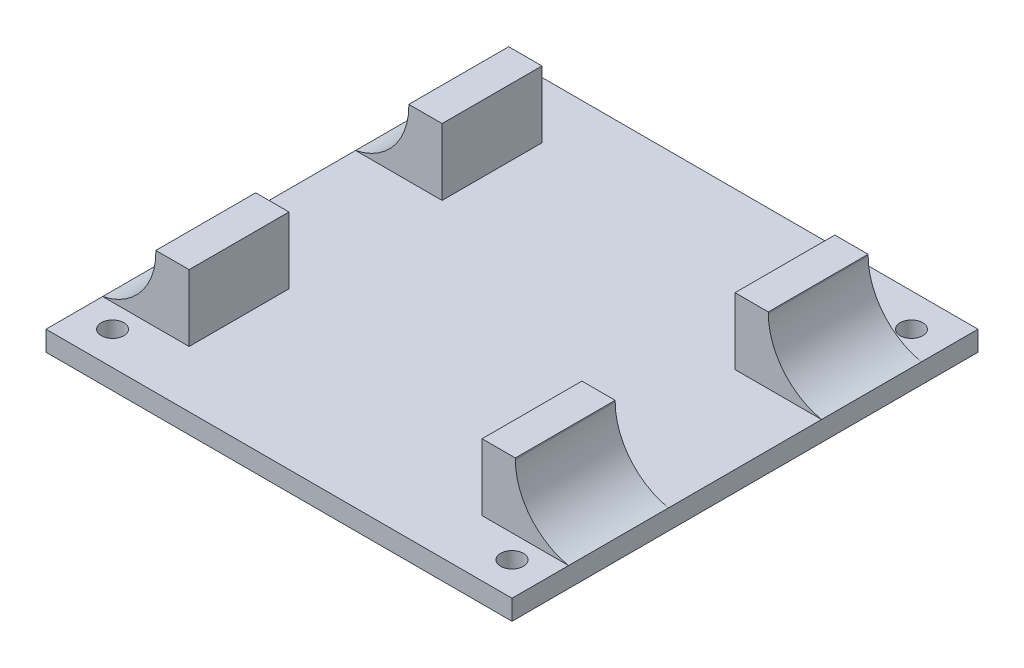
ISO-10303-21;
HEADER;
FILE_DESCRIPTION(('STEP AP214'),'2;1');
FILE_NAME('part.step','',(''),(''),'','','');
FILE_SCHEMA(('AUTOMOTIVE_DESIGN { 1 0 10303 214 1 1 1 1 }'));
ENDSEC;
DATA;
#1=APPLICATION_CONTEXT('core data for automotive mechanical design processes');
#2=APPLICATION_PROTOCOL_DEFINITION('international standard','automotive_design',2000,#1);
#3=PRODUCT_CONTEXT('',#1,'mechanical');
#4=PRODUCT('Part','Part','',(#3));
#5=PRODUCT_RELATED_PRODUCT_CATEGORY('part','',(#4));
#6=PRODUCT_DEFINITION_FORMATION('','',#4);
#7=PRODUCT_DEFINITION_CONTEXT('part definition',#1,'design');
#8=PRODUCT_DEFINITION('design','',#6,#7);
#9=PRODUCT_DEFINITION_SHAPE('','',#8);
#10=(LENGTH_UNIT() NAMED_UNIT(*) SI_UNIT(.MILLI.,.METRE.));
#11=(NAMED_UNIT(*) PLANE_ANGLE_UNIT() SI_UNIT($,.RADIAN.));
#12=(NAMED_UNIT(*) SI_UNIT($,.STERADIAN.) SOLID_ANGLE_UNIT());
#13=UNCERTAINTY_MEASURE_WITH_UNIT(LENGTH_MEASURE(1.E-05),#10,'distance_accuracy_value','');
#14=(GEOMETRIC_REPRESENTATION_CONTEXT(3) GLOBAL_UNCERTAINTY_ASSIGNED_CONTEXT((#13)) GLOBAL_UNIT_ASSIGNED_CONTEXT((#10,
#11,#12)) REPRESENTATION_CONTEXT('',''));
#15=CARTESIAN_POINT('',(0.,0.,0.));
#16=DIRECTION('',(0.,0.,1.));
#17=DIRECTION('',(1.,0.,0.));
#18=AXIS2_PLACEMENT_3D('',#15,#16,#17);
#19=CARTESIAN_POINT('',(0.,3.,0.));
#20=DIRECTION('',(0.,-1.,0.));
#21=DIRECTION('',(0.,0.,-1.));
#22=AXIS2_PLACEMENT_3D('',#19,#20,#21);
#23=PLANE('',#22);
#24=DIRECTION('',(-1.,0.,0.));
#25=VECTOR('',#24,1.);
#26=CARTESIAN_POINT('',(57.,3.,-23.5));
#27=LINE('',#26,#25);
#28=CARTESIAN_POINT('',(70.,3.,-23.5));
#29=VERTEX_POINT('',#28);
#30=CARTESIAN_POINT('',(57.,3.,-23.5));
#31=VERTEX_POINT('',#30);
#32=EDGE_CURVE('E250',#29,#31,#27,.T.);
#33=ORIENTED_EDGE('',*,*,#32,.F.);
#34=DIRECTION('',(0.,0.,-1.));
#35=VECTOR('',#34,1.);
#36=CARTESIAN_POINT('',(70.,3.,0.));
#37=LINE('',#36,#35);
#38=CARTESIAN_POINT('',(70.,3.,-46.5));
#39=VERTEX_POINT('',#38);
#40=EDGE_CURVE('E528',#29,#39,#37,.T.);
#41=ORIENTED_EDGE('',*,*,#40,.T.);
#42=DIRECTION('',(1.,0.,0.));
#43=VECTOR('',#42,1.);
#44=CARTESIAN_POINT('',(57.,3.,-46.5));
#45=LINE('',#44,#43);
#46=CARTESIAN_POINT('',(57.,3.,-46.5));
#47=VERTEX_POINT('',#46);
#48=EDGE_CURVE('E303',#47,#39,#45,.T.);
#49=ORIENTED_EDGE('',*,*,#48,.F.);
#50=DIRECTION('',(0.,0.,1.));
#51=VECTOR('',#50,1.);
#52=CARTESIAN_POINT('',(57.,3.,-61.5));
#53=LINE('',#52,#51);
#54=CARTESIAN_POINT('',(57.,3.,-61.5));
#55=VERTEX_POINT('',#54);
#56=EDGE_CURVE('E306',#55,#47,#53,.T.);
#57=ORIENTED_EDGE('',*,*,#56,.F.);
#58=DIRECTION('',(-1.,0.,0.));
#59=VECTOR('',#58,1.);
#60=CARTESIAN_POINT('',(57.,3.,-61.5));
#61=LINE('',#60,#59);
#62=CARTESIAN_POINT('',(70.,3.,-61.5));
#63=VERTEX_POINT('',#62);
#64=EDGE_CURVE('E311',#63,#55,#61,.T.);
#65=ORIENTED_EDGE('',*,*,#64,.F.);
#66=CARTESIAN_POINT('',(70.,3.,-70.));
#67=VERTEX_POINT('',#66);
#68=EDGE_CURVE('E407',#63,#67,#37,.T.);
#69=ORIENTED_EDGE('',*,*,#68,.T.);
#70=DIRECTION('',(-1.,0.,0.));
#71=VECTOR('',#70,1.);
#72=CARTESIAN_POINT('',(0.,3.,-70.));
#73=LINE('',#72,#71);
#74=CARTESIAN_POINT('',(0.,3.,-70.));
#75=VERTEX_POINT('',#74);
#76=EDGE_CURVE('E412',#67,#75,#73,.T.);
#77=ORIENTED_EDGE('',*,*,#76,.T.);
#78=DIRECTION('',(0.,0.,1.));
#79=VECTOR('',#78,1.);
#80=CARTESIAN_POINT('',(0.,3.,0.));
#81=LINE('',#80,#79);
#82=CARTESIAN_POINT('',(0.,3.,-61.5));
#83=VERTEX_POINT('',#82);
#84=EDGE_CURVE('E398',#75,#83,#81,.T.);
#85=ORIENTED_EDGE('',*,*,#84,.T.);
#86=DIRECTION('',(-1.,0.,0.));
#87=VECTOR('',#86,1.);
#88=CARTESIAN_POINT('',(8.00000000000001,3.,-61.5));
#89=LINE('',#88,#87);
#90=CARTESIAN_POINT('',(13.,3.,-61.5));
#91=VERTEX_POINT('',#90);
#92=EDGE_CURVE('E345',#91,#83,#89,.T.);
#93=ORIENTED_EDGE('',*,*,#92,.F.);
#94=DIRECTION('',(0.,0.,-1.));
#95=VECTOR('',#94,1.);
#96=CARTESIAN_POINT('',(13.,3.,-61.5));
#97=LINE('',#96,#95);
#98=CARTESIAN_POINT('',(13.,3.,-46.5));
#99=VERTEX_POINT('',#98);
#100=EDGE_CURVE('E315',#99,#91,#97,.T.);
#101=ORIENTED_EDGE('',*,*,#100,.F.);
#102=DIRECTION('',(1.,0.,0.));
#103=VECTOR('',#102,1.);
#104=CARTESIAN_POINT('',(8.00000000000001,3.,-46.5));
#105=LINE('',#104,#103);
#106=CARTESIAN_POINT('',(0.,3.,-46.5));
#107=VERTEX_POINT('',#106);
#108=EDGE_CURVE('E332',#107,#99,#105,.T.);
#109=ORIENTED_EDGE('',*,*,#108,.F.);
#110=CARTESIAN_POINT('',(0.,3.,-23.5));
#111=VERTEX_POINT('',#110);
#112=EDGE_CURVE('E488',#107,#111,#81,.T.);
#113=ORIENTED_EDGE('',*,*,#112,.T.);
#114=DIRECTION('',(-1.,0.,0.));
#115=VECTOR('',#114,1.);
#116=CARTESIAN_POINT('',(8.00000000000001,3.,-23.5));
#117=LINE('',#116,#115);
#118=CARTESIAN_POINT('',(13.,3.,-23.5));
#119=VERTEX_POINT('',#118);
#120=EDGE_CURVE('E267',#119,#111,#117,.T.);
#121=ORIENTED_EDGE('',*,*,#120,.F.);
#122=DIRECTION('',(0.,0.,-1.));
#123=VECTOR('',#122,1.);
#124=CARTESIAN_POINT('',(13.,3.,-23.5));
#125=LINE('',#124,#123);
#126=CARTESIAN_POINT('',(13.,3.,-8.5));
#127=VERTEX_POINT('',#126);
#128=EDGE_CURVE('E271',#127,#119,#125,.T.);
#129=ORIENTED_EDGE('',*,*,#128,.F.);
#130=DIRECTION('',(1.,0.,0.));
#131=VECTOR('',#130,1.);
#132=CARTESIAN_POINT('',(8.00000000000001,3.,-8.5));
#133=LINE('',#132,#131);
#134=CARTESIAN_POINT('',(0.,3.,-8.5));
#135=VERTEX_POINT('',#134);
#136=EDGE_CURVE('E263',#135,#127,#133,.T.);
#137=ORIENTED_EDGE('',*,*,#136,.F.);
#138=CARTESIAN_POINT('',(0.,3.,0.));
#139=VERTEX_POINT('',#138);
#140=EDGE_CURVE('E404',#135,#139,#81,.T.);
#141=ORIENTED_EDGE('',*,*,#140,.T.);
#142=DIRECTION('',(1.,0.,0.));
#143=VECTOR('',#142,1.);
#144=CARTESIAN_POINT('',(0.,3.,0.));
#145=LINE('',#144,#143);
#146=CARTESIAN_POINT('',(70.,3.,0.));
#147=VERTEX_POINT('',#146);
#148=EDGE_CURVE('E402',#139,#147,#145,.T.);
#149=ORIENTED_EDGE('',*,*,#148,.T.);
#150=CARTESIAN_POINT('',(70.,3.,-8.5));
#151=VERTEX_POINT('',#150);
#152=EDGE_CURVE('E408',#147,#151,#37,.T.);
#153=ORIENTED_EDGE('',*,*,#152,.T.);
#154=DIRECTION('',(1.,0.,0.));
#155=VECTOR('',#154,1.);
#156=CARTESIAN_POINT('',(57.,3.,-8.5));
#157=LINE('',#156,#155);
#158=CARTESIAN_POINT('',(57.,3.,-8.5));
#159=VERTEX_POINT('',#158);
#160=EDGE_CURVE('E235',#159,#151,#157,.T.);
#161=ORIENTED_EDGE('',*,*,#160,.F.);
#162=DIRECTION('',(0.,0.,1.));
#163=VECTOR('',#162,1.);
#164=CARTESIAN_POINT('',(57.,3.,-23.5));
#165=LINE('',#164,#163);
#166=EDGE_CURVE('E240',#31,#159,#165,.T.);
#167=ORIENTED_EDGE('',*,*,#166,.F.);
#168=EDGE_LOOP('',(#33,#41,#49,#57,#65,#69,#77,#85,#93,#101,#109,#113,#121,#129,#137,#141,#149,
#153,#161,#167));
#169=FACE_BOUND('',#168,.T.);
#170=CARTESIAN_POINT('',(65.,3.,-65.));
#171=DIRECTION('',(0.,1.,0.));
#172=DIRECTION('',(0.,0.,1.));
#173=AXIS2_PLACEMENT_3D('',#170,#171,#172);
#174=CIRCLE('',#173,1.7);
#175=CARTESIAN_POINT('',(65.,3.,-63.3));
#176=VERTEX_POINT('',#175);
#177=EDGE_CURVE('E390',#176,#176,#174,.T.);
#178=ORIENTED_EDGE('',*,*,#177,.F.);
#179=EDGE_LOOP('',(#178));
#180=FACE_BOUND('',#179,.T.);
#181=CARTESIAN_POINT('',(5.,3.,-65.));
#182=DIRECTION('',(0.,1.,0.));
#183=DIRECTION('',(0.,0.,-1.));
#184=AXIS2_PLACEMENT_3D('',#181,#182,#183);
#185=CIRCLE('',#184,1.69999999999999);
#186=CARTESIAN_POINT('',(5.,3.,-66.7));
#187=VERTEX_POINT('',#186);
#188=EDGE_CURVE('E382',#187,#187,#185,.T.);
#189=ORIENTED_EDGE('',*,*,#188,.F.);
#190=EDGE_LOOP('',(#189));
#191=FACE_BOUND('',#190,.T.);
#192=CARTESIAN_POINT('',(65.,3.,-5.));
#193=DIRECTION('',(0.,1.,0.));
#194=DIRECTION('',(0.,0.,-1.));
#195=AXIS2_PLACEMENT_3D('',#192,#193,#194);
#196=CIRCLE('',#195,1.7);
#197=CARTESIAN_POINT('',(65.,3.,-6.7));
#198=VERTEX_POINT('',#197);
#199=EDGE_CURVE('E374',#198,#198,#196,.T.);
#200=ORIENTED_EDGE('',*,*,#199,.F.);
#201=EDGE_LOOP('',(#200));
#202=FACE_BOUND('',#201,.T.);
#203=CARTESIAN_POINT('',(5.,3.,-5.));
#204=DIRECTION('',(0.,1.,0.));
#205=DIRECTION('',(0.,0.,1.));
#206=AXIS2_PLACEMENT_3D('',#203,#204,#205);
#207=CIRCLE('',#206,1.69999999999999);
#208=CARTESIAN_POINT('',(5.,3.,-3.30000000000001));
#209=VERTEX_POINT('',#208);
#210=EDGE_CURVE('E366',#209,#209,#207,.T.);
#211=ORIENTED_EDGE('',*,*,#210,.F.);
#212=EDGE_LOOP('',(#211));
#213=FACE_BOUND('',#212,.T.);
#214=ADVANCED_FACE('F45',(#169,#180,#191,#202,#213),#23,.F.);
#215=CARTESIAN_POINT('',(0.,0.,0.));
#216=DIRECTION('',(0.,-1.,0.));
#217=DIRECTION('',(0.,0.,-1.));
#218=AXIS2_PLACEMENT_3D('',#215,#216,#217);
#219=PLANE('',#218);
#220=CARTESIAN_POINT('',(65.,0.,-5.));
#221=DIRECTION('',(0.,1.,0.));
#222=DIRECTION('',(0.,0.,-1.));
#223=AXIS2_PLACEMENT_3D('',#220,#221,#222);
#224=CIRCLE('',#223,1.7);
#225=CARTESIAN_POINT('',(65.,0.,-6.7));
#226=VERTEX_POINT('',#225);
#227=EDGE_CURVE('E370',#226,#226,#224,.T.);
#228=ORIENTED_EDGE('',*,*,#227,.T.);
#229=EDGE_LOOP('',(#228));
#230=FACE_BOUND('',#229,.T.);
#231=CARTESIAN_POINT('',(65.,0.,-65.));
#232=DIRECTION('',(0.,1.,0.));
#233=DIRECTION('',(0.,0.,1.));
#234=AXIS2_PLACEMENT_3D('',#231,#232,#233);
#235=CIRCLE('',#234,1.7);
#236=CARTESIAN_POINT('',(65.,0.,-63.3));
#237=VERTEX_POINT('',#236);
#238=EDGE_CURVE('E386',#237,#237,#235,.T.);
#239=ORIENTED_EDGE('',*,*,#238,.T.);
#240=EDGE_LOOP('',(#239));
#241=FACE_BOUND('',#240,.T.);
#242=DIRECTION('',(0.,0.,1.));
#243=VECTOR('',#242,1.);
#244=CARTESIAN_POINT('',(0.,0.,0.));
#245=LINE('',#244,#243);
#246=CARTESIAN_POINT('',(0.,0.,-70.));
#247=VERTEX_POINT('',#246);
#248=CARTESIAN_POINT('',(0.,0.,0.));
#249=VERTEX_POINT('',#248);
#250=EDGE_CURVE('E394',#247,#249,#245,.T.);
#251=ORIENTED_EDGE('',*,*,#250,.F.);
#252=DIRECTION('',(-1.,0.,0.));
#253=VECTOR('',#252,1.);
#254=CARTESIAN_POINT('',(0.,0.,-70.));
#255=LINE('',#254,#253);
#256=CARTESIAN_POINT('',(70.,0.,-70.));
#257=VERTEX_POINT('',#256);
#258=EDGE_CURVE('E426',#257,#247,#255,.T.);
#259=ORIENTED_EDGE('',*,*,#258,.F.);
#260=DIRECTION('',(0.,0.,-1.));
#261=VECTOR('',#260,1.);
#262=CARTESIAN_POINT('',(70.,0.,0.));
#263=LINE('',#262,#261);
#264=CARTESIAN_POINT('',(70.,0.,0.));
#265=VERTEX_POINT('',#264);
#266=EDGE_CURVE('E423',#265,#257,#263,.T.);
#267=ORIENTED_EDGE('',*,*,#266,.F.);
#268=DIRECTION('',(1.,0.,0.));
#269=VECTOR('',#268,1.);
#270=CARTESIAN_POINT('',(0.,0.,0.));
#271=LINE('',#270,#269);
#272=EDGE_CURVE('E420',#249,#265,#271,.T.);
#273=ORIENTED_EDGE('',*,*,#272,.F.);
#274=EDGE_LOOP('',(#251,#259,#267,#273));
#275=FACE_BOUND('',#274,.T.);
#276=CARTESIAN_POINT('',(5.,0.,-65.));
#277=DIRECTION('',(0.,1.,0.));
#278=DIRECTION('',(0.,0.,-1.));
#279=AXIS2_PLACEMENT_3D('',#276,#277,#278);
#280=CIRCLE('',#279,1.69999999999999);
#281=CARTESIAN_POINT('',(5.,0.,-66.7));
#282=VERTEX_POINT('',#281);
#283=EDGE_CURVE('E378',#282,#282,#280,.T.);
#284=ORIENTED_EDGE('',*,*,#283,.T.);
#285=EDGE_LOOP('',(#284));
#286=FACE_BOUND('',#285,.T.);
#287=CARTESIAN_POINT('',(5.,0.,-5.));
#288=DIRECTION('',(0.,1.,0.));
#289=DIRECTION('',(0.,0.,1.));
#290=AXIS2_PLACEMENT_3D('',#287,#288,#289);
#291=CIRCLE('',#290,1.69999999999999);
#292=CARTESIAN_POINT('',(5.,0.,-3.30000000000001));
#293=VERTEX_POINT('',#292);
#294=EDGE_CURVE('E365',#293,#293,#291,.T.);
#295=ORIENTED_EDGE('',*,*,#294,.T.);
#296=EDGE_LOOP('',(#295));
#297=FACE_BOUND('',#296,.T.);
#298=ADVANCED_FACE('F549',(#230,#241,#275,#286,#297),#219,.T.);
#299=CARTESIAN_POINT('',(0.,3.,0.));
#300=DIRECTION('',(1.,0.,0.));
#301=DIRECTION('',(0.,0.,-1.));
#302=AXIS2_PLACEMENT_3D('',#299,#300,#301);
#303=PLANE('',#302);
#304=ORIENTED_EDGE('',*,*,#250,.T.);
#305=DIRECTION('',(0.,-1.,0.));
#306=VECTOR('',#305,1.);
#307=CARTESIAN_POINT('',(0.,3.,0.));
#308=LINE('',#307,#306);
#309=EDGE_CURVE('E440',#139,#249,#308,.T.);
#310=ORIENTED_EDGE('',*,*,#309,.F.);
#311=ORIENTED_EDGE('',*,*,#140,.F.);
#312=EDGE_CURVE('E493',#111,#135,#81,.T.);
#313=ORIENTED_EDGE('',*,*,#312,.F.);
#314=ORIENTED_EDGE('',*,*,#112,.F.);
#315=EDGE_CURVE('E403',#83,#107,#81,.T.);
#316=ORIENTED_EDGE('',*,*,#315,.F.);
#317=ORIENTED_EDGE('',*,*,#84,.F.);
#318=DIRECTION('',(0.,-1.,0.));
#319=VECTOR('',#318,1.);
#320=CARTESIAN_POINT('',(0.,3.,-70.));
#321=LINE('',#320,#319);
#322=EDGE_CURVE('E416',#75,#247,#321,.T.);
#323=ORIENTED_EDGE('',*,*,#322,.T.);
#324=EDGE_LOOP('',(#304,#310,#311,#313,#314,#316,#317,#323));
#325=FACE_BOUND('',#324,.T.);
#326=ADVANCED_FACE('F489',(#325),#303,.F.);
#327=CARTESIAN_POINT('',(0.,3.,0.));
#328=DIRECTION('',(0.,0.,-1.));
#329=DIRECTION('',(-1.,0.,0.));
#330=AXIS2_PLACEMENT_3D('',#327,#328,#329);
#331=PLANE('',#330);
#332=ORIENTED_EDGE('',*,*,#272,.T.);
#333=DIRECTION('',(0.,-1.,0.));
#334=VECTOR('',#333,1.);
#335=CARTESIAN_POINT('',(70.,3.,0.));
#336=LINE('',#335,#334);
#337=EDGE_CURVE('E436',#147,#265,#336,.T.);
#338=ORIENTED_EDGE('',*,*,#337,.F.);
#339=ORIENTED_EDGE('',*,*,#148,.F.);
#340=ORIENTED_EDGE('',*,*,#309,.T.);
#341=EDGE_LOOP('',(#332,#338,#339,#340));
#342=FACE_BOUND('',#341,.T.);
#343=ADVANCED_FACE('F567',(#342),#331,.F.);
#344=CARTESIAN_POINT('',(70.,3.,0.));
#345=DIRECTION('',(-1.,0.,0.));
#346=DIRECTION('',(0.,0.,1.));
#347=AXIS2_PLACEMENT_3D('',#344,#345,#346);
#348=PLANE('',#347);
#349=ORIENTED_EDGE('',*,*,#266,.T.);
#350=DIRECTION('',(0.,-1.,0.));
#351=VECTOR('',#350,1.);
#352=CARTESIAN_POINT('',(70.,3.,-70.));
#353=LINE('',#352,#351);
#354=EDGE_CURVE('E432',#67,#257,#353,.T.);
#355=ORIENTED_EDGE('',*,*,#354,.F.);
#356=ORIENTED_EDGE('',*,*,#68,.F.);
#357=EDGE_CURVE('E752',#39,#63,#37,.T.);
#358=ORIENTED_EDGE('',*,*,#357,.F.);
#359=ORIENTED_EDGE('',*,*,#40,.F.);
#360=EDGE_CURVE('E413',#151,#29,#37,.T.);
#361=ORIENTED_EDGE('',*,*,#360,.F.);
#362=ORIENTED_EDGE('',*,*,#152,.F.);
#363=ORIENTED_EDGE('',*,*,#337,.T.);
#364=EDGE_LOOP('',(#349,#355,#356,#358,#359,#361,#362,#363));
#365=FACE_BOUND('',#364,.T.);
#366=ADVANCED_FACE('F525',(#365),#348,.F.);
#367=CARTESIAN_POINT('',(0.,3.,-70.));
#368=DIRECTION('',(0.,0.,1.));
#369=DIRECTION('',(1.,0.,0.));
#370=AXIS2_PLACEMENT_3D('',#367,#368,#369);
#371=PLANE('',#370);
#372=ORIENTED_EDGE('',*,*,#258,.T.);
#373=ORIENTED_EDGE('',*,*,#322,.F.);
#374=ORIENTED_EDGE('',*,*,#76,.F.);
#375=ORIENTED_EDGE('',*,*,#354,.T.);
#376=EDGE_LOOP('',(#372,#373,#374,#375));
#377=FACE_BOUND('',#376,.T.);
#378=ADVANCED_FACE('F561',(#377),#371,.F.);
#379=CARTESIAN_POINT('',(65.,3.,-65.));
#380=DIRECTION('',(0.,-1.,0.));
#381=DIRECTION('',(0.,0.,-1.));
#382=AXIS2_PLACEMENT_3D('',#379,#380,#381);
#383=CYLINDRICAL_SURFACE('',#382,1.7);
#384=ORIENTED_EDGE('',*,*,#177,.T.);
#385=EDGE_LOOP('',(#384));
#386=FACE_BOUND('',#385,.T.);
#387=ORIENTED_EDGE('',*,*,#238,.F.);
#388=EDGE_LOOP('',(#387));
#389=FACE_BOUND('',#388,.T.);
#390=ADVANCED_FACE('F558',(#386,#389),#383,.F.);
#391=CARTESIAN_POINT('',(5.,3.,-65.));
#392=DIRECTION('',(0.,-1.,0.));
#393=DIRECTION('',(0.,0.,-1.));
#394=AXIS2_PLACEMENT_3D('',#391,#392,#393);
#395=CYLINDRICAL_SURFACE('',#394,1.69999999999999);
#396=ORIENTED_EDGE('',*,*,#188,.T.);
#397=EDGE_LOOP('',(#396));
#398=FACE_BOUND('',#397,.T.);
#399=ORIENTED_EDGE('',*,*,#283,.F.);
#400=EDGE_LOOP('',(#399));
#401=FACE_BOUND('',#400,.T.);
#402=ADVANCED_FACE('F784',(#398,#401),#395,.F.);
#403=CARTESIAN_POINT('',(65.,3.,-5.));
#404=DIRECTION('',(0.,-1.,0.));
#405=DIRECTION('',(0.,0.,-1.));
#406=AXIS2_PLACEMENT_3D('',#403,#404,#405);
#407=CYLINDRICAL_SURFACE('',#406,1.7);
#408=ORIENTED_EDGE('',*,*,#199,.T.);
#409=EDGE_LOOP('',(#408));
#410=FACE_BOUND('',#409,.T.);
#411=ORIENTED_EDGE('',*,*,#227,.F.);
#412=EDGE_LOOP('',(#411));
#413=FACE_BOUND('',#412,.T.);
#414=ADVANCED_FACE('F781',(#410,#413),#407,.F.);
#415=CARTESIAN_POINT('',(5.,3.,-5.));
#416=DIRECTION('',(0.,-1.,0.));
#417=DIRECTION('',(0.,0.,-1.));
#418=AXIS2_PLACEMENT_3D('',#415,#416,#417);
#419=CYLINDRICAL_SURFACE('',#418,1.69999999999999);
#420=ORIENTED_EDGE('',*,*,#210,.T.);
#421=EDGE_LOOP('',(#420));
#422=FACE_BOUND('',#421,.T.);
#423=ORIENTED_EDGE('',*,*,#294,.F.);
#424=EDGE_LOOP('',(#423));
#425=FACE_BOUND('',#424,.T.);
#426=ADVANCED_FACE('F777',(#422,#425),#419,.F.);
#427=CARTESIAN_POINT('',(13.,13.,-61.5));
#428=DIRECTION('',(-1.,0.,0.));
#429=DIRECTION('',(0.,0.,1.));
#430=AXIS2_PLACEMENT_3D('',#427,#428,#429);
#431=PLANE('',#430);
#432=ORIENTED_EDGE('',*,*,#100,.T.);
#433=DIRECTION('',(0.,-1.,0.));
#434=VECTOR('',#433,1.);
#435=CARTESIAN_POINT('',(13.,13.,-61.5));
#436=LINE('',#435,#434);
#437=CARTESIAN_POINT('',(13.,13.,-61.5));
#438=VERTEX_POINT('',#437);
#439=EDGE_CURVE('E361',#438,#91,#436,.T.);
#440=ORIENTED_EDGE('',*,*,#439,.F.);
#441=DIRECTION('',(0.,0.,-1.));
#442=VECTOR('',#441,1.);
#443=CARTESIAN_POINT('',(13.,13.,-61.5));
#444=LINE('',#443,#442);
#445=CARTESIAN_POINT('',(13.,13.,-46.5));
#446=VERTEX_POINT('',#445);
#447=EDGE_CURVE('E327',#446,#438,#444,.T.);
#448=ORIENTED_EDGE('',*,*,#447,.F.);
#449=DIRECTION('',(0.,-1.,0.));
#450=VECTOR('',#449,1.);
#451=CARTESIAN_POINT('',(13.,13.,-46.5));
#452=LINE('',#451,#450);
#453=EDGE_CURVE('E341',#446,#99,#452,.T.);
#454=ORIENTED_EDGE('',*,*,#453,.T.);
#455=EDGE_LOOP('',(#432,#440,#448,#454));
#456=FACE_BOUND('',#455,.T.);
#457=ADVANCED_FACE('F589',(#456),#431,.F.);
#458=CARTESIAN_POINT('',(8.00000000000001,13.,-61.5));
#459=DIRECTION('',(0.,0.,1.));
#460=DIRECTION('',(1.,0.,0.));
#461=AXIS2_PLACEMENT_3D('',#458,#459,#460);
#462=PLANE('',#461);
#463=ORIENTED_EDGE('',*,*,#92,.T.);
#464=CARTESIAN_POINT('',(-1.99999999999999,12.7979589711327,-61.5));
#465=DIRECTION('',(0.,0.,1.));
#466=DIRECTION('',(1.,0.,0.));
#467=AXIS2_PLACEMENT_3D('',#464,#465,#466);
#468=CIRCLE('',#467,10.);
#469=CARTESIAN_POINT('',(8.00000000000001,12.7979589711327,-61.5));
#470=VERTEX_POINT('',#469);
#471=EDGE_CURVE('E11',#83,#470,#468,.T.);
#472=ORIENTED_EDGE('',*,*,#471,.T.);
#473=DIRECTION('',(0.,-1.,0.));
#474=VECTOR('',#473,1.);
#475=CARTESIAN_POINT('',(8.00000000000001,13.,-61.5));
#476=LINE('',#475,#474);
#477=CARTESIAN_POINT('',(8.00000000000001,13.,-61.5));
#478=VERTEX_POINT('',#477);
#479=EDGE_CURVE('E358',#478,#470,#476,.T.);
#480=ORIENTED_EDGE('',*,*,#479,.F.);
#481=DIRECTION('',(-1.,0.,0.));
#482=VECTOR('',#481,1.);
#483=CARTESIAN_POINT('',(8.00000000000001,13.,-61.5));
#484=LINE('',#483,#482);
#485=EDGE_CURVE('E331',#438,#478,#484,.T.);
#486=ORIENTED_EDGE('',*,*,#485,.F.);
#487=ORIENTED_EDGE('',*,*,#439,.T.);
#488=EDGE_LOOP('',(#463,#472,#480,#486,#487));
#489=FACE_BOUND('',#488,.T.);
#490=ADVANCED_FACE('F584',(#489),#462,.F.);
#491=CARTESIAN_POINT('',(8.00000000000001,13.,-61.5));
#492=DIRECTION('',(1.,0.,0.));
#493=DIRECTION('',(0.,0.,-1.));
#494=AXIS2_PLACEMENT_3D('',#491,#492,#493);
#495=PLANE('',#494);
#496=ORIENTED_EDGE('',*,*,#479,.T.);
#497=DIRECTION('',(0.,0.,1.));
#498=VECTOR('',#497,1.);
#499=CARTESIAN_POINT('',(8.00000000000001,12.7979589711327,-61.5));
#500=LINE('',#499,#498);
#501=CARTESIAN_POINT('',(8.00000000000001,12.7979589711327,-46.5));
#502=VERTEX_POINT('',#501);
#503=EDGE_CURVE('E455',#470,#502,#500,.T.);
#504=ORIENTED_EDGE('',*,*,#503,.T.);
#505=DIRECTION('',(0.,-1.,0.));
#506=VECTOR('',#505,1.);
#507=CARTESIAN_POINT('',(8.00000000000001,13.,-46.5));
#508=LINE('',#507,#506);
#509=CARTESIAN_POINT('',(8.00000000000001,13.,-46.5));
#510=VERTEX_POINT('',#509);
#511=EDGE_CURVE('E354',#510,#502,#508,.T.);
#512=ORIENTED_EDGE('',*,*,#511,.F.);
#513=DIRECTION('',(0.,0.,1.));
#514=VECTOR('',#513,1.);
#515=CARTESIAN_POINT('',(8.00000000000001,13.,-61.5));
#516=LINE('',#515,#514);
#517=EDGE_CURVE('E335',#478,#510,#516,.T.);
#518=ORIENTED_EDGE('',*,*,#517,.F.);
#519=EDGE_LOOP('',(#496,#504,#512,#518));
#520=FACE_BOUND('',#519,.T.);
#521=ADVANCED_FACE('F588',(#520),#495,.F.);
#522=CARTESIAN_POINT('',(8.00000000000001,13.,-46.5));
#523=DIRECTION('',(0.,0.,-1.));
#524=DIRECTION('',(-1.,0.,0.));
#525=AXIS2_PLACEMENT_3D('',#522,#523,#524);
#526=PLANE('',#525);
#527=ORIENTED_EDGE('',*,*,#108,.T.);
#528=ORIENTED_EDGE('',*,*,#453,.F.);
#529=DIRECTION('',(1.,0.,0.));
#530=VECTOR('',#529,1.);
#531=CARTESIAN_POINT('',(8.00000000000001,13.,-46.5));
#532=LINE('',#531,#530);
#533=EDGE_CURVE('E338',#510,#446,#532,.T.);
#534=ORIENTED_EDGE('',*,*,#533,.F.);
#535=ORIENTED_EDGE('',*,*,#511,.T.);
#536=CARTESIAN_POINT('',(-1.99999999999999,12.7979589711327,-46.5));
#537=DIRECTION('',(0.,0.,-1.));
#538=DIRECTION('',(-1.,0.,0.));
#539=AXIS2_PLACEMENT_3D('',#536,#537,#538);
#540=CIRCLE('',#539,10.);
#541=EDGE_CURVE('E54',#502,#107,#540,.T.);
#542=ORIENTED_EDGE('',*,*,#541,.T.);
#543=EDGE_LOOP('',(#527,#528,#534,#535,#542));
#544=FACE_BOUND('',#543,.T.);
#545=ADVANCED_FACE('F480',(#544),#526,.F.);
#546=CARTESIAN_POINT('',(0.,13.,0.));
#547=DIRECTION('',(0.,1.,0.));
#548=DIRECTION('',(0.,0.,1.));
#549=AXIS2_PLACEMENT_3D('',#546,#547,#548);
#550=PLANE('',#549);
#551=ORIENTED_EDGE('',*,*,#447,.T.);
#552=ORIENTED_EDGE('',*,*,#485,.T.);
#553=ORIENTED_EDGE('',*,*,#517,.T.);
#554=ORIENTED_EDGE('',*,*,#533,.T.);
#555=EDGE_LOOP('',(#551,#552,#553,#554));
#556=FACE_BOUND('',#555,.T.);
#557=ADVANCED_FACE('F606',(#556),#550,.T.);
#558=CARTESIAN_POINT('',(62.,13.,-61.5));
#559=DIRECTION('',(-1.,0.,0.));
#560=DIRECTION('',(0.,0.,1.));
#561=AXIS2_PLACEMENT_3D('',#558,#559,#560);
#562=PLANE('',#561);
#563=DIRECTION('',(0.,-1.,0.));
#564=VECTOR('',#563,1.);
#565=CARTESIAN_POINT('',(62.,13.,-46.5));
#566=LINE('',#565,#564);
#567=CARTESIAN_POINT('',(62.,13.,-46.5));
#568=VERTEX_POINT('',#567);
#569=CARTESIAN_POINT('',(62.,12.7979589711327,-46.5));
#570=VERTEX_POINT('',#569);
#571=EDGE_CURVE('E298',#568,#570,#566,.T.);
#572=ORIENTED_EDGE('',*,*,#571,.T.);
#573=DIRECTION('',(0.,0.,-1.));
#574=VECTOR('',#573,1.);
#575=CARTESIAN_POINT('',(62.,12.7979589711327,-61.5));
#576=LINE('',#575,#574);
#577=CARTESIAN_POINT('',(62.,12.7979589711327,-61.5));
#578=VERTEX_POINT('',#577);
#579=EDGE_CURVE('E447',#570,#578,#576,.T.);
#580=ORIENTED_EDGE('',*,*,#579,.T.);
#581=DIRECTION('',(0.,-1.,0.));
#582=VECTOR('',#581,1.);
#583=CARTESIAN_POINT('',(62.,13.,-61.5));
#584=LINE('',#583,#582);
#585=CARTESIAN_POINT('',(62.,13.,-61.5));
#586=VERTEX_POINT('',#585);
#587=EDGE_CURVE('E275',#586,#578,#584,.T.);
#588=ORIENTED_EDGE('',*,*,#587,.F.);
#589=DIRECTION('',(0.,0.,-1.));
#590=VECTOR('',#589,1.);
#591=CARTESIAN_POINT('',(62.,13.,-61.5));
#592=LINE('',#591,#590);
#593=EDGE_CURVE('E307',#568,#586,#592,.T.);
#594=ORIENTED_EDGE('',*,*,#593,.F.);
#595=EDGE_LOOP('',(#572,#580,#588,#594));
#596=FACE_BOUND('',#595,.T.);
#597=ADVANCED_FACE('F612',(#596),#562,.F.);
#598=CARTESIAN_POINT('',(57.,13.,-61.5));
#599=DIRECTION('',(0.,0.,1.));
#600=DIRECTION('',(1.,0.,0.));
#601=AXIS2_PLACEMENT_3D('',#598,#599,#600);
#602=PLANE('',#601);
#603=ORIENTED_EDGE('',*,*,#64,.T.);
#604=DIRECTION('',(0.,-1.,0.));
#605=VECTOR('',#604,1.);
#606=CARTESIAN_POINT('',(57.,13.,-61.5));
#607=LINE('',#606,#605);
#608=CARTESIAN_POINT('',(57.,13.,-61.5));
#609=VERTEX_POINT('',#608);
#610=EDGE_CURVE('E290',#609,#55,#607,.T.);
#611=ORIENTED_EDGE('',*,*,#610,.F.);
#612=DIRECTION('',(-1.,0.,0.));
#613=VECTOR('',#612,1.);
#614=CARTESIAN_POINT('',(57.,13.,-61.5));
#615=LINE('',#614,#613);
#616=EDGE_CURVE('E321',#586,#609,#615,.T.);
#617=ORIENTED_EDGE('',*,*,#616,.F.);
#618=ORIENTED_EDGE('',*,*,#587,.T.);
#619=CARTESIAN_POINT('',(72.,12.7979589711327,-61.5));
#620=DIRECTION('',(0.,0.,1.));
#621=DIRECTION('',(1.,0.,0.));
#622=AXIS2_PLACEMENT_3D('',#619,#620,#621);
#623=CIRCLE('',#622,10.);
#624=EDGE_CURVE('E464',#578,#63,#623,.T.);
#625=ORIENTED_EDGE('',*,*,#624,.T.);
#626=EDGE_LOOP('',(#603,#611,#617,#618,#625));
#627=FACE_BOUND('',#626,.T.);
#628=ADVANCED_FACE('F616',(#627),#602,.F.);
#629=CARTESIAN_POINT('',(57.,13.,-61.5));
#630=DIRECTION('',(1.,0.,0.));
#631=DIRECTION('',(0.,0.,-1.));
#632=AXIS2_PLACEMENT_3D('',#629,#630,#631);
#633=PLANE('',#632);
#634=ORIENTED_EDGE('',*,*,#56,.T.);
#635=DIRECTION('',(0.,-1.,0.));
#636=VECTOR('',#635,1.);
#637=CARTESIAN_POINT('',(57.,13.,-46.5));
#638=LINE('',#637,#636);
#639=CARTESIAN_POINT('',(57.,13.,-46.5));
#640=VERTEX_POINT('',#639);
#641=EDGE_CURVE('E294',#640,#47,#638,.T.);
#642=ORIENTED_EDGE('',*,*,#641,.F.);
#643=DIRECTION('',(0.,0.,1.));
#644=VECTOR('',#643,1.);
#645=CARTESIAN_POINT('',(57.,13.,-61.5));
#646=LINE('',#645,#644);
#647=EDGE_CURVE('E318',#609,#640,#646,.T.);
#648=ORIENTED_EDGE('',*,*,#647,.F.);
#649=ORIENTED_EDGE('',*,*,#610,.T.);
#650=EDGE_LOOP('',(#634,#642,#648,#649));
#651=FACE_BOUND('',#650,.T.);
#652=ADVANCED_FACE('F625',(#651),#633,.F.);
#653=CARTESIAN_POINT('',(57.,13.,-46.5));
#654=DIRECTION('',(0.,0.,-1.));
#655=DIRECTION('',(-1.,0.,0.));
#656=AXIS2_PLACEMENT_3D('',#653,#654,#655);
#657=PLANE('',#656);
#658=ORIENTED_EDGE('',*,*,#48,.T.);
#659=CARTESIAN_POINT('',(72.,12.7979589711327,-46.5));
#660=DIRECTION('',(0.,0.,-1.));
#661=DIRECTION('',(-1.,0.,0.));
#662=AXIS2_PLACEMENT_3D('',#659,#660,#661);
#663=CIRCLE('',#662,10.);
#664=EDGE_CURVE('E468',#39,#570,#663,.T.);
#665=ORIENTED_EDGE('',*,*,#664,.T.);
#666=ORIENTED_EDGE('',*,*,#571,.F.);
#667=DIRECTION('',(1.,0.,0.));
#668=VECTOR('',#667,1.);
#669=CARTESIAN_POINT('',(57.,13.,-46.5));
#670=LINE('',#669,#668);
#671=EDGE_CURVE('E302',#640,#568,#670,.T.);
#672=ORIENTED_EDGE('',*,*,#671,.F.);
#673=ORIENTED_EDGE('',*,*,#641,.T.);
#674=EDGE_LOOP('',(#658,#665,#666,#672,#673));
#675=FACE_BOUND('',#674,.T.);
#676=ADVANCED_FACE('F632',(#675),#657,.F.);
#677=CARTESIAN_POINT('',(0.,13.,0.));
#678=DIRECTION('',(0.,1.,0.));
#679=DIRECTION('',(0.,0.,1.));
#680=AXIS2_PLACEMENT_3D('',#677,#678,#679);
#681=PLANE('',#680);
#682=ORIENTED_EDGE('',*,*,#593,.T.);
#683=ORIENTED_EDGE('',*,*,#616,.T.);
#684=ORIENTED_EDGE('',*,*,#647,.T.);
#685=ORIENTED_EDGE('',*,*,#671,.T.);
#686=EDGE_LOOP('',(#682,#683,#684,#685));
#687=FACE_BOUND('',#686,.T.);
#688=ADVANCED_FACE('F636',(#687),#681,.T.);
#689=CARTESIAN_POINT('',(13.,13.,-23.5));
#690=DIRECTION('',(-1.,0.,0.));
#691=DIRECTION('',(0.,0.,1.));
#692=AXIS2_PLACEMENT_3D('',#689,#690,#691);
#693=PLANE('',#692);
#694=ORIENTED_EDGE('',*,*,#128,.T.);
#695=DIRECTION('',(0.,-1.,0.));
#696=VECTOR('',#695,1.);
#697=CARTESIAN_POINT('',(13.,13.,-23.5));
#698=LINE('',#697,#696);
#699=CARTESIAN_POINT('',(13.,13.,-23.5));
#700=VERTEX_POINT('',#699);
#701=EDGE_CURVE('E245',#700,#119,#698,.T.);
#702=ORIENTED_EDGE('',*,*,#701,.F.);
#703=DIRECTION('',(0.,0.,-1.));
#704=VECTOR('',#703,1.);
#705=CARTESIAN_POINT('',(13.,13.,-23.5));
#706=LINE('',#705,#704);
#707=CARTESIAN_POINT('',(13.,13.,-8.5));
#708=VERTEX_POINT('',#707);
#709=EDGE_CURVE('E268',#708,#700,#706,.T.);
#710=ORIENTED_EDGE('',*,*,#709,.F.);
#711=DIRECTION('',(0.,-1.,0.));
#712=VECTOR('',#711,1.);
#713=CARTESIAN_POINT('',(13.,13.,-8.5));
#714=LINE('',#713,#712);
#715=EDGE_CURVE('E258',#708,#127,#714,.T.);
#716=ORIENTED_EDGE('',*,*,#715,.T.);
#717=EDGE_LOOP('',(#694,#702,#710,#716));
#718=FACE_BOUND('',#717,.T.);
#719=ADVANCED_FACE('F648',(#718),#693,.F.);
#720=CARTESIAN_POINT('',(8.00000000000001,13.,-23.5));
#721=DIRECTION('',(0.,0.,1.));
#722=DIRECTION('',(1.,0.,0.));
#723=AXIS2_PLACEMENT_3D('',#720,#721,#722);
#724=PLANE('',#723);
#725=ORIENTED_EDGE('',*,*,#120,.T.);
#726=CARTESIAN_POINT('',(-1.99999999999999,12.7979589711327,-23.5));
#727=DIRECTION('',(0.,0.,1.));
#728=DIRECTION('',(1.,0.,0.));
#729=AXIS2_PLACEMENT_3D('',#726,#727,#728);
#730=CIRCLE('',#729,10.);
#731=CARTESIAN_POINT('',(8.00000000000001,12.7979589711327,-23.5));
#732=VERTEX_POINT('',#731);
#733=EDGE_CURVE('E475',#111,#732,#730,.T.);
#734=ORIENTED_EDGE('',*,*,#733,.T.);
#735=DIRECTION('',(0.,-1.,0.));
#736=VECTOR('',#735,1.);
#737=CARTESIAN_POINT('',(8.00000000000001,13.,-23.5));
#738=LINE('',#737,#736);
#739=CARTESIAN_POINT('',(8.00000000000001,13.,-23.5));
#740=VERTEX_POINT('',#739);
#741=EDGE_CURVE('E249',#740,#732,#738,.T.);
#742=ORIENTED_EDGE('',*,*,#741,.F.);
#743=DIRECTION('',(-1.,0.,0.));
#744=VECTOR('',#743,1.);
#745=CARTESIAN_POINT('',(8.00000000000001,13.,-23.5));
#746=LINE('',#745,#744);
#747=EDGE_CURVE('E281',#700,#740,#746,.T.);
#748=ORIENTED_EDGE('',*,*,#747,.F.);
#749=ORIENTED_EDGE('',*,*,#701,.T.);
#750=EDGE_LOOP('',(#725,#734,#742,#748,#749));
#751=FACE_BOUND('',#750,.T.);
#752=ADVANCED_FACE('F643',(#751),#724,.F.);
#753=CARTESIAN_POINT('',(8.00000000000001,13.,-23.5));
#754=DIRECTION('',(1.,0.,0.));
#755=DIRECTION('',(0.,0.,-1.));
#756=AXIS2_PLACEMENT_3D('',#753,#754,#755);
#757=PLANE('',#756);
#758=ORIENTED_EDGE('',*,*,#741,.T.);
#759=DIRECTION('',(0.,0.,1.));
#760=VECTOR('',#759,1.);
#761=CARTESIAN_POINT('',(8.00000000000001,12.7979589711327,-23.5));
#762=LINE('',#761,#760);
#763=CARTESIAN_POINT('',(8.00000000000001,12.7979589711327,-8.5));
#764=VERTEX_POINT('',#763);
#765=EDGE_CURVE('E451',#732,#764,#762,.T.);
#766=ORIENTED_EDGE('',*,*,#765,.T.);
#767=DIRECTION('',(0.,-1.,0.));
#768=VECTOR('',#767,1.);
#769=CARTESIAN_POINT('',(8.00000000000001,13.,-8.5));
#770=LINE('',#769,#768);
#771=CARTESIAN_POINT('',(8.00000000000001,13.,-8.5));
#772=VERTEX_POINT('',#771);
#773=EDGE_CURVE('E254',#772,#764,#770,.T.);
#774=ORIENTED_EDGE('',*,*,#773,.F.);
#775=DIRECTION('',(0.,0.,1.));
#776=VECTOR('',#775,1.);
#777=CARTESIAN_POINT('',(8.00000000000001,13.,-23.5));
#778=LINE('',#777,#776);
#779=EDGE_CURVE('E278',#740,#772,#778,.T.);
#780=ORIENTED_EDGE('',*,*,#779,.F.);
#781=EDGE_LOOP('',(#758,#766,#774,#780));
#782=FACE_BOUND('',#781,.T.);
#783=ADVANCED_FACE('F647',(#782),#757,.F.);
#784=CARTESIAN_POINT('',(8.00000000000001,13.,-8.5));
#785=DIRECTION('',(0.,0.,-1.));
#786=DIRECTION('',(-1.,0.,0.));
#787=AXIS2_PLACEMENT_3D('',#784,#785,#786);
#788=PLANE('',#787);
#789=ORIENTED_EDGE('',*,*,#136,.T.);
#790=ORIENTED_EDGE('',*,*,#715,.F.);
#791=DIRECTION('',(1.,0.,0.));
#792=VECTOR('',#791,1.);
#793=CARTESIAN_POINT('',(8.00000000000001,13.,-8.5));
#794=LINE('',#793,#792);
#795=EDGE_CURVE('E262',#772,#708,#794,.T.);
#796=ORIENTED_EDGE('',*,*,#795,.F.);
#797=ORIENTED_EDGE('',*,*,#773,.T.);
#798=CARTESIAN_POINT('',(-1.99999999999999,12.7979589711327,-8.5));
#799=DIRECTION('',(0.,0.,-1.));
#800=DIRECTION('',(-1.,0.,0.));
#801=AXIS2_PLACEMENT_3D('',#798,#799,#800);
#802=CIRCLE('',#801,10.);
#803=EDGE_CURVE('E471',#764,#135,#802,.T.);
#804=ORIENTED_EDGE('',*,*,#803,.T.);
#805=EDGE_LOOP('',(#789,#790,#796,#797,#804));
#806=FACE_BOUND('',#805,.T.);
#807=ADVANCED_FACE('F658',(#806),#788,.F.);
#808=CARTESIAN_POINT('',(0.,13.,0.));
#809=DIRECTION('',(0.,1.,0.));
#810=DIRECTION('',(0.,0.,1.));
#811=AXIS2_PLACEMENT_3D('',#808,#809,#810);
#812=PLANE('',#811);
#813=ORIENTED_EDGE('',*,*,#709,.T.);
#814=ORIENTED_EDGE('',*,*,#747,.T.);
#815=ORIENTED_EDGE('',*,*,#779,.T.);
#816=ORIENTED_EDGE('',*,*,#795,.T.);
#817=EDGE_LOOP('',(#813,#814,#815,#816));
#818=FACE_BOUND('',#817,.T.);
#819=ADVANCED_FACE('F667',(#818),#812,.T.);
#820=CARTESIAN_POINT('',(62.,13.,-23.5));
#821=DIRECTION('',(-1.,0.,0.));
#822=DIRECTION('',(0.,0.,1.));
#823=AXIS2_PLACEMENT_3D('',#820,#821,#822);
#824=PLANE('',#823);
#825=DIRECTION('',(0.,-1.,0.));
#826=VECTOR('',#825,1.);
#827=CARTESIAN_POINT('',(62.,13.,-8.5));
#828=LINE('',#827,#826);
#829=CARTESIAN_POINT('',(62.,13.,-8.5));
#830=VERTEX_POINT('',#829);
#831=CARTESIAN_POINT('',(62.,12.7979589711327,-8.5));
#832=VERTEX_POINT('',#831);
#833=EDGE_CURVE('E219',#830,#832,#828,.T.);
#834=ORIENTED_EDGE('',*,*,#833,.T.);
#835=DIRECTION('',(0.,0.,-1.));
#836=VECTOR('',#835,1.);
#837=CARTESIAN_POINT('',(62.,12.7979589711327,-23.5));
#838=LINE('',#837,#836);
#839=CARTESIAN_POINT('',(62.,12.7979589711327,-23.5));
#840=VERTEX_POINT('',#839);
#841=EDGE_CURVE('E444',#832,#840,#838,.T.);
#842=ORIENTED_EDGE('',*,*,#841,.T.);
#843=DIRECTION('',(0.,-1.,0.));
#844=VECTOR('',#843,1.);
#845=CARTESIAN_POINT('',(62.,13.,-23.5));
#846=LINE('',#845,#844);
#847=CARTESIAN_POINT('',(62.,13.,-23.5));
#848=VERTEX_POINT('',#847);
#849=EDGE_CURVE('E233',#848,#840,#846,.T.);
#850=ORIENTED_EDGE('',*,*,#849,.F.);
#851=DIRECTION('',(0.,0.,-1.));
#852=VECTOR('',#851,1.);
#853=CARTESIAN_POINT('',(62.,13.,-23.5));
#854=LINE('',#853,#852);
#855=EDGE_CURVE('E211',#830,#848,#854,.T.);
#856=ORIENTED_EDGE('',*,*,#855,.F.);
#857=EDGE_LOOP('',(#834,#842,#850,#856));
#858=FACE_BOUND('',#857,.T.);
#859=ADVANCED_FACE('F231',(#858),#824,.F.);
#860=CARTESIAN_POINT('',(57.,13.,-23.5));
#861=DIRECTION('',(0.,0.,1.));
#862=DIRECTION('',(1.,0.,0.));
#863=AXIS2_PLACEMENT_3D('',#860,#861,#862);
#864=PLANE('',#863);
#865=ORIENTED_EDGE('',*,*,#32,.T.);
#866=DIRECTION('',(0.,-1.,0.));
#867=VECTOR('',#866,1.);
#868=CARTESIAN_POINT('',(57.,13.,-23.5));
#869=LINE('',#868,#867);
#870=CARTESIAN_POINT('',(57.,13.,-23.5));
#871=VERTEX_POINT('',#870);
#872=EDGE_CURVE('E511',#871,#31,#869,.T.);
#873=ORIENTED_EDGE('',*,*,#872,.F.);
#874=DIRECTION('',(-1.,0.,0.));
#875=VECTOR('',#874,1.);
#876=CARTESIAN_POINT('',(57.,13.,-23.5));
#877=LINE('',#876,#875);
#878=EDGE_CURVE('E236',#848,#871,#877,.T.);
#879=ORIENTED_EDGE('',*,*,#878,.F.);
#880=ORIENTED_EDGE('',*,*,#849,.T.);
#881=CARTESIAN_POINT('',(72.,12.7979589711327,-23.5));
#882=DIRECTION('',(0.,0.,1.));
#883=DIRECTION('',(1.,0.,0.));
#884=AXIS2_PLACEMENT_3D('',#881,#882,#883);
#885=CIRCLE('',#884,10.);
#886=EDGE_CURVE('E458',#840,#29,#885,.T.);
#887=ORIENTED_EDGE('',*,*,#886,.T.);
#888=EDGE_LOOP('',(#865,#873,#879,#880,#887));
#889=FACE_BOUND('',#888,.T.);
#890=ADVANCED_FACE('F517',(#889),#864,.F.);
#891=CARTESIAN_POINT('',(57.,13.,-23.5));
#892=DIRECTION('',(1.,0.,0.));
#893=DIRECTION('',(0.,0.,-1.));
#894=AXIS2_PLACEMENT_3D('',#891,#892,#893);
#895=PLANE('',#894);
#896=ORIENTED_EDGE('',*,*,#166,.T.);
#897=DIRECTION('',(0.,-1.,0.));
#898=VECTOR('',#897,1.);
#899=CARTESIAN_POINT('',(57.,13.,-8.5));
#900=LINE('',#899,#898);
#901=CARTESIAN_POINT('',(57.,13.,-8.5));
#902=VERTEX_POINT('',#901);
#903=EDGE_CURVE('E229',#902,#159,#900,.T.);
#904=ORIENTED_EDGE('',*,*,#903,.F.);
#905=DIRECTION('',(0.,0.,1.));
#906=VECTOR('',#905,1.);
#907=CARTESIAN_POINT('',(57.,13.,-23.5));
#908=LINE('',#907,#906);
#909=EDGE_CURVE('E214',#871,#902,#908,.T.);
#910=ORIENTED_EDGE('',*,*,#909,.F.);
#911=ORIENTED_EDGE('',*,*,#872,.T.);
#912=EDGE_LOOP('',(#896,#904,#910,#911));
#913=FACE_BOUND('',#912,.T.);
#914=ADVANCED_FACE('F520',(#913),#895,.F.);
#915=CARTESIAN_POINT('',(57.,13.,-8.5));
#916=DIRECTION('',(0.,0.,-1.));
#917=DIRECTION('',(-1.,0.,0.));
#918=AXIS2_PLACEMENT_3D('',#915,#916,#917);
#919=PLANE('',#918);
#920=ORIENTED_EDGE('',*,*,#160,.T.);
#921=CARTESIAN_POINT('',(72.,12.7979589711327,-8.5));
#922=DIRECTION('',(0.,0.,-1.));
#923=DIRECTION('',(-1.,0.,0.));
#924=AXIS2_PLACEMENT_3D('',#921,#922,#923);
#925=CIRCLE('',#924,10.);
#926=EDGE_CURVE('E224',#151,#832,#925,.T.);
#927=ORIENTED_EDGE('',*,*,#926,.T.);
#928=ORIENTED_EDGE('',*,*,#833,.F.);
#929=DIRECTION('',(1.,0.,0.));
#930=VECTOR('',#929,1.);
#931=CARTESIAN_POINT('',(57.,13.,-8.5));
#932=LINE('',#931,#930);
#933=EDGE_CURVE('E207',#902,#830,#932,.T.);
#934=ORIENTED_EDGE('',*,*,#933,.F.);
#935=ORIENTED_EDGE('',*,*,#903,.T.);
#936=EDGE_LOOP('',(#920,#927,#928,#934,#935));
#937=FACE_BOUND('',#936,.T.);
#938=ADVANCED_FACE('F222',(#937),#919,.F.);
#939=CARTESIAN_POINT('',(0.,13.,0.));
#940=DIRECTION('',(0.,1.,0.));
#941=DIRECTION('',(0.,0.,1.));
#942=AXIS2_PLACEMENT_3D('',#939,#940,#941);
#943=PLANE('',#942);
#944=ORIENTED_EDGE('',*,*,#855,.T.);
#945=ORIENTED_EDGE('',*,*,#878,.T.);
#946=ORIENTED_EDGE('',*,*,#909,.T.);
#947=ORIENTED_EDGE('',*,*,#933,.T.);
#948=EDGE_LOOP('',(#944,#945,#946,#947));
#949=FACE_BOUND('',#948,.T.);
#950=ADVANCED_FACE('F209',(#949),#943,.T.);
#951=CARTESIAN_POINT('',(72.,12.7979589711327,0.));
#952=DIRECTION('',(0.,0.,-1.));
#953=DIRECTION('',(-1.,0.,0.));
#954=AXIS2_PLACEMENT_3D('',#951,#952,#953);
#955=CYLINDRICAL_SURFACE('',#954,10.);
#956=ORIENTED_EDGE('',*,*,#926,.F.);
#957=ORIENTED_EDGE('',*,*,#360,.T.);
#958=ORIENTED_EDGE('',*,*,#886,.F.);
#959=ORIENTED_EDGE('',*,*,#841,.F.);
#960=EDGE_LOOP('',(#956,#957,#958,#959));
#961=FACE_BOUND('',#960,.T.);
#962=ADVANCED_FACE('F534',(#961),#955,.F.);
#963=CARTESIAN_POINT('',(72.,12.7979589711327,0.));
#964=DIRECTION('',(0.,0.,-1.));
#965=DIRECTION('',(-1.,0.,0.));
#966=AXIS2_PLACEMENT_3D('',#963,#964,#965);
#967=CYLINDRICAL_SURFACE('',#966,10.);
#968=ORIENTED_EDGE('',*,*,#664,.F.);
#969=ORIENTED_EDGE('',*,*,#357,.T.);
#970=ORIENTED_EDGE('',*,*,#624,.F.);
#971=ORIENTED_EDGE('',*,*,#579,.F.);
#972=EDGE_LOOP('',(#968,#969,#970,#971));
#973=FACE_BOUND('',#972,.T.);
#974=ADVANCED_FACE('F536',(#973),#967,.F.);
#975=CARTESIAN_POINT('',(-1.99999999999999,12.7979589711327,0.));
#976=DIRECTION('',(0.,0.,1.));
#977=DIRECTION('',(1.,0.,0.));
#978=AXIS2_PLACEMENT_3D('',#975,#976,#977);
#979=CYLINDRICAL_SURFACE('',#978,10.);
#980=ORIENTED_EDGE('',*,*,#733,.F.);
#981=ORIENTED_EDGE('',*,*,#312,.T.);
#982=ORIENTED_EDGE('',*,*,#803,.F.);
#983=ORIENTED_EDGE('',*,*,#765,.F.);
#984=EDGE_LOOP('',(#980,#981,#982,#983));
#985=FACE_BOUND('',#984,.T.);
#986=ADVANCED_FACE('F542',(#985),#979,.F.);
#987=CARTESIAN_POINT('',(-1.99999999999999,12.7979589711327,0.));
#988=DIRECTION('',(0.,0.,1.));
#989=DIRECTION('',(1.,0.,0.));
#990=AXIS2_PLACEMENT_3D('',#987,#988,#989);
#991=CYLINDRICAL_SURFACE('',#990,10.);
#992=ORIENTED_EDGE('',*,*,#471,.F.);
#993=ORIENTED_EDGE('',*,*,#315,.T.);
#994=ORIENTED_EDGE('',*,*,#541,.F.);
#995=ORIENTED_EDGE('',*,*,#503,.F.);
#996=EDGE_LOOP('',(#992,#993,#994,#995));
#997=FACE_BOUND('',#996,.T.);
#998=ADVANCED_FACE('F47',(#997),#991,.F.);
#999=CLOSED_SHELL('',(#214,#298,#326,#343,#366,#378,#390,#402,#414,#426,#457,#490,#521,#545,
#557,#597,#628,#652,#676,#688,#719,#752,#783,#807,#819,#859,#890,#914,#938,#950,#962,#974,#986,#998));
#1000=MANIFOLD_SOLID_BREP('B2',#999);
#1001=ADVANCED_BREP_SHAPE_REPRESENTATION('',(#18,#1000),#14);
#1002=SHAPE_DEFINITION_REPRESENTATION(#9,#1001);
ENDSEC;
END-ISO-10303-21;
